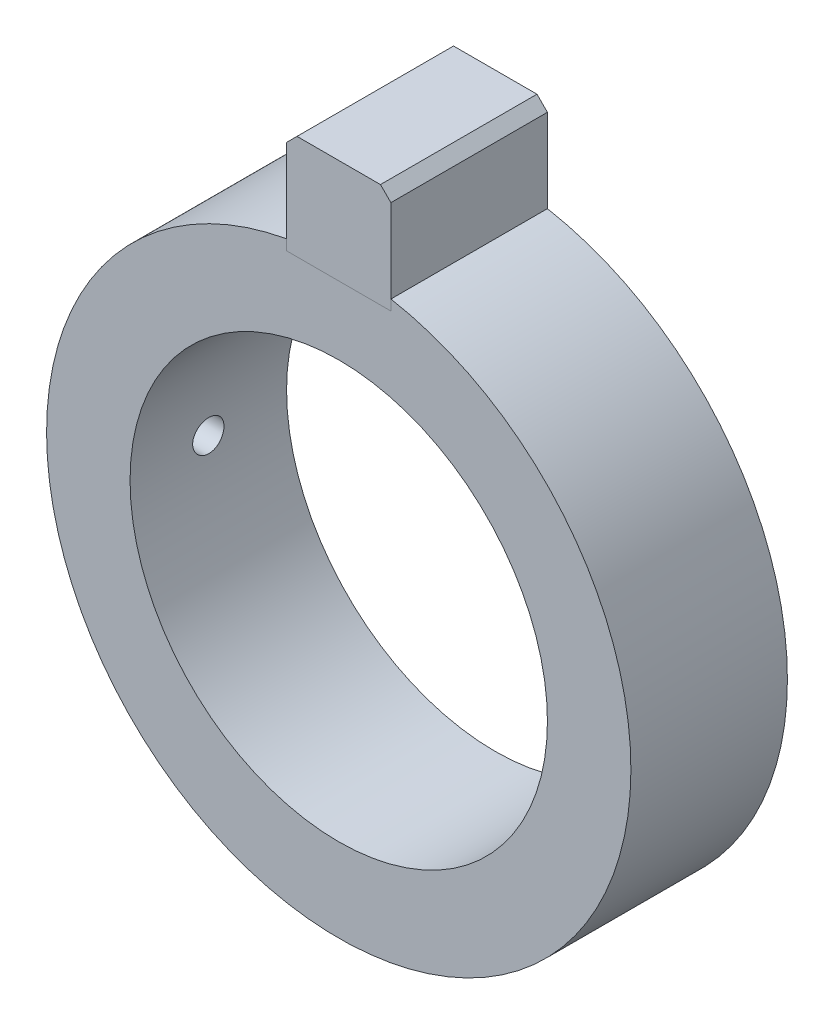
ISO-10303-21;
HEADER;
FILE_DESCRIPTION(('STEP AP214'),'2;1');
FILE_NAME('part.step','',(''),(''),'','','');
FILE_SCHEMA(('AUTOMOTIVE_DESIGN { 1 0 10303 214 1 1 1 1 }'));
ENDSEC;
DATA;
#1=APPLICATION_CONTEXT('core data for automotive mechanical design processes');
#2=APPLICATION_PROTOCOL_DEFINITION('international standard','automotive_design',2000,#1);
#3=PRODUCT_CONTEXT('',#1,'mechanical');
#4=PRODUCT('Part','Part','',(#3));
#5=PRODUCT_RELATED_PRODUCT_CATEGORY('part','',(#4));
#6=PRODUCT_DEFINITION_FORMATION('','',#4);
#7=PRODUCT_DEFINITION_CONTEXT('part definition',#1,'design');
#8=PRODUCT_DEFINITION('design','',#6,#7);
#9=PRODUCT_DEFINITION_SHAPE('','',#8);
#10=(LENGTH_UNIT() NAMED_UNIT(*) SI_UNIT(.MILLI.,.METRE.));
#11=(NAMED_UNIT(*) PLANE_ANGLE_UNIT() SI_UNIT($,.RADIAN.));
#12=(NAMED_UNIT(*) SI_UNIT($,.STERADIAN.) SOLID_ANGLE_UNIT());
#13=UNCERTAINTY_MEASURE_WITH_UNIT(LENGTH_MEASURE(1.E-05),#10,'distance_accuracy_value','');
#14=(GEOMETRIC_REPRESENTATION_CONTEXT(3) GLOBAL_UNCERTAINTY_ASSIGNED_CONTEXT((#13)) GLOBAL_UNIT_ASSIGNED_CONTEXT((#10,
#11,#12)) REPRESENTATION_CONTEXT('',''));
#15=CARTESIAN_POINT('',(0.,0.,0.));
#16=DIRECTION('',(0.,0.,1.));
#17=DIRECTION('',(1.,0.,0.));
#18=AXIS2_PLACEMENT_3D('',#15,#16,#17);
#19=CARTESIAN_POINT('',(-5.,36.5499546279118,15.));
#20=DIRECTION('',(0.,0.,-1.));
#21=DIRECTION('',(-1.,0.,0.));
#22=AXIS2_PLACEMENT_3D('',#19,#20,#21);
#23=PLANE('',#22);
#24=DIRECTION('',(0.,-1.,0.));
#25=VECTOR('',#24,1.);
#26=CARTESIAN_POINT('',(5.,36.5499546279118,15.));
#27=LINE('',#26,#25);
#28=CARTESIAN_POINT('',(5.,35.5499546279118,15.));
#29=VERTEX_POINT('',#28);
#30=CARTESIAN_POINT('',(5.,26.5499546279118,15.));
#31=VERTEX_POINT('',#30);
#32=EDGE_CURVE('E12',#29,#31,#27,.T.);
#33=ORIENTED_EDGE('',*,*,#32,.F.);
#34=DIRECTION('',(0.707106781186547,-0.707106781186548,0.));
#35=VECTOR('',#34,1.);
#36=CARTESIAN_POINT('',(4.,36.5499546279118,15.));
#37=LINE('',#36,#35);
#38=CARTESIAN_POINT('',(4.,36.5499546279118,15.));
#39=VERTEX_POINT('',#38);
#40=EDGE_CURVE('E100',#39,#29,#37,.T.);
#41=ORIENTED_EDGE('',*,*,#40,.F.);
#42=DIRECTION('',(1.,0.,0.));
#43=VECTOR('',#42,1.);
#44=CARTESIAN_POINT('',(-5.,36.5499546279118,15.));
#45=LINE('',#44,#43);
#46=CARTESIAN_POINT('',(-4.,36.5499546279118,15.));
#47=VERTEX_POINT('',#46);
#48=EDGE_CURVE('E127',#47,#39,#45,.T.);
#49=ORIENTED_EDGE('',*,*,#48,.F.);
#50=DIRECTION('',(0.707106781186547,0.707106781186548,0.));
#51=VECTOR('',#50,1.);
#52=CARTESIAN_POINT('',(-4.,36.5499546279118,15.));
#53=LINE('',#52,#51);
#54=CARTESIAN_POINT('',(-5.,35.5499546279118,15.));
#55=VERTEX_POINT('',#54);
#56=EDGE_CURVE('E70',#55,#47,#53,.T.);
#57=ORIENTED_EDGE('',*,*,#56,.F.);
#58=DIRECTION('',(0.,-1.,0.));
#59=VECTOR('',#58,1.);
#60=CARTESIAN_POINT('',(-5.,36.5499546279118,15.));
#61=LINE('',#60,#59);
#62=CARTESIAN_POINT('',(-5.,26.5499546279118,15.));
#63=VERTEX_POINT('',#62);
#64=EDGE_CURVE('E120',#55,#63,#61,.T.);
#65=ORIENTED_EDGE('',*,*,#64,.T.);
#66=DIRECTION('',(1.,0.,0.));
#67=VECTOR('',#66,1.);
#68=CARTESIAN_POINT('',(-5.,26.5499546279118,15.));
#69=LINE('',#68,#67);
#70=EDGE_CURVE('E131',#63,#31,#69,.T.);
#71=ORIENTED_EDGE('',*,*,#70,.T.);
#72=EDGE_LOOP('',(#33,#41,#49,#57,#65,#71));
#73=FACE_BOUND('',#72,.T.);
#74=ADVANCED_FACE('F48',(#73),#23,.F.);
#75=CARTESIAN_POINT('',(5.,36.5499546279118,15.));
#76=DIRECTION('',(-1.,0.,0.));
#77=DIRECTION('',(0.,0.,1.));
#78=AXIS2_PLACEMENT_3D('',#75,#76,#77);
#79=PLANE('',#78);
#80=DIRECTION('',(0.,-1.,0.));
#81=VECTOR('',#80,1.);
#82=CARTESIAN_POINT('',(5.,36.5499546279118,0.));
#83=LINE('',#82,#81);
#84=CARTESIAN_POINT('',(5.,35.5499546279118,0.));
#85=VERTEX_POINT('',#84);
#86=CARTESIAN_POINT('',(5.,26.5499546279118,0.));
#87=VERTEX_POINT('',#86);
#88=EDGE_CURVE('E55',#85,#87,#83,.T.);
#89=ORIENTED_EDGE('',*,*,#88,.F.);
#90=DIRECTION('',(0.,0.,-1.));
#91=VECTOR('',#90,1.);
#92=CARTESIAN_POINT('',(5.,35.5499546279118,16.4142135623731));
#93=LINE('',#92,#91);
#94=EDGE_CURVE('E97',#29,#85,#93,.T.);
#95=ORIENTED_EDGE('',*,*,#94,.F.);
#96=ORIENTED_EDGE('',*,*,#32,.T.);
#97=DIRECTION('',(0.,0.,-1.));
#98=VECTOR('',#97,1.);
#99=CARTESIAN_POINT('',(5.,26.5499546279118,15.));
#100=LINE('',#99,#98);
#101=EDGE_CURVE('E117',#31,#87,#100,.T.);
#102=ORIENTED_EDGE('',*,*,#101,.T.);
#103=EDGE_LOOP('',(#89,#95,#96,#102));
#104=FACE_BOUND('',#103,.T.);
#105=ADVANCED_FACE('F115',(#104),#79,.F.);
#106=CARTESIAN_POINT('',(5.,36.5499546279118,0.));
#107=DIRECTION('',(0.,0.,1.));
#108=DIRECTION('',(1.,0.,0.));
#109=AXIS2_PLACEMENT_3D('',#106,#107,#108);
#110=PLANE('',#109);
#111=DIRECTION('',(-1.,0.,0.));
#112=VECTOR('',#111,1.);
#113=CARTESIAN_POINT('',(5.,36.5499546279118,0.));
#114=LINE('',#113,#112);
#115=CARTESIAN_POINT('',(4.,36.5499546279118,0.));
#116=VERTEX_POINT('',#115);
#117=CARTESIAN_POINT('',(-4.,36.5499546279118,0.));
#118=VERTEX_POINT('',#117);
#119=EDGE_CURVE('E113',#116,#118,#114,.T.);
#120=ORIENTED_EDGE('',*,*,#119,.F.);
#121=DIRECTION('',(-0.707106781186547,0.707106781186548,0.));
#122=VECTOR('',#121,1.);
#123=CARTESIAN_POINT('',(4.,36.5499546279118,0.));
#124=LINE('',#123,#122);
#125=EDGE_CURVE('E62',#85,#116,#124,.T.);
#126=ORIENTED_EDGE('',*,*,#125,.F.);
#127=ORIENTED_EDGE('',*,*,#88,.T.);
#128=DIRECTION('',(-1.,0.,0.));
#129=VECTOR('',#128,1.);
#130=CARTESIAN_POINT('',(5.,26.5499546279118,0.));
#131=LINE('',#130,#129);
#132=CARTESIAN_POINT('',(-5.,26.5499546279118,0.));
#133=VERTEX_POINT('',#132);
#134=EDGE_CURVE('E128',#87,#133,#131,.T.);
#135=ORIENTED_EDGE('',*,*,#134,.T.);
#136=DIRECTION('',(0.,-1.,0.));
#137=VECTOR('',#136,1.);
#138=CARTESIAN_POINT('',(-5.,36.5499546279118,0.));
#139=LINE('',#138,#137);
#140=CARTESIAN_POINT('',(-5.,35.5499546279118,0.));
#141=VERTEX_POINT('',#140);
#142=EDGE_CURVE('E119',#141,#133,#139,.T.);
#143=ORIENTED_EDGE('',*,*,#142,.F.);
#144=DIRECTION('',(-0.707106781186547,-0.707106781186548,0.));
#145=VECTOR('',#144,1.);
#146=CARTESIAN_POINT('',(-4.,36.5499546279118,0.));
#147=LINE('',#146,#145);
#148=EDGE_CURVE('E140',#118,#141,#147,.T.);
#149=ORIENTED_EDGE('',*,*,#148,.F.);
#150=EDGE_LOOP('',(#120,#126,#127,#135,#143,#149));
#151=FACE_BOUND('',#150,.T.);
#152=ADVANCED_FACE('F108',(#151),#110,.F.);
#153=CARTESIAN_POINT('',(-5.,36.5499546279118,0.));
#154=DIRECTION('',(1.,0.,0.));
#155=DIRECTION('',(0.,0.,-1.));
#156=AXIS2_PLACEMENT_3D('',#153,#154,#155);
#157=PLANE('',#156);
#158=ORIENTED_EDGE('',*,*,#64,.F.);
#159=DIRECTION('',(0.,0.,-1.));
#160=VECTOR('',#159,1.);
#161=CARTESIAN_POINT('',(-5.,35.5499546279118,16.4142135623731));
#162=LINE('',#161,#160);
#163=EDGE_CURVE('E139',#55,#141,#162,.T.);
#164=ORIENTED_EDGE('',*,*,#163,.T.);
#165=ORIENTED_EDGE('',*,*,#142,.T.);
#166=DIRECTION('',(0.,0.,1.));
#167=VECTOR('',#166,1.);
#168=CARTESIAN_POINT('',(-5.,26.5499546279118,0.));
#169=LINE('',#168,#167);
#170=EDGE_CURVE('E124',#133,#63,#169,.T.);
#171=ORIENTED_EDGE('',*,*,#170,.T.);
#172=EDGE_LOOP('',(#158,#164,#165,#171));
#173=FACE_BOUND('',#172,.T.);
#174=ADVANCED_FACE('F157',(#173),#157,.F.);
#175=CARTESIAN_POINT('',(0.,36.5499546279118,0.));
#176=DIRECTION('',(0.,1.,0.));
#177=DIRECTION('',(0.,0.,1.));
#178=AXIS2_PLACEMENT_3D('',#175,#176,#177);
#179=PLANE('',#178);
#180=DIRECTION('',(0.,0.,-1.));
#181=VECTOR('',#180,1.);
#182=CARTESIAN_POINT('',(4.,36.5499546279118,16.4142135623731));
#183=LINE('',#182,#181);
#184=EDGE_CURVE('E104',#39,#116,#183,.T.);
#185=ORIENTED_EDGE('',*,*,#184,.T.);
#186=ORIENTED_EDGE('',*,*,#119,.T.);
#187=DIRECTION('',(0.,0.,-1.));
#188=VECTOR('',#187,1.);
#189=CARTESIAN_POINT('',(-4.,36.5499546279118,16.4142135623731));
#190=LINE('',#189,#188);
#191=EDGE_CURVE('E137',#47,#118,#190,.T.);
#192=ORIENTED_EDGE('',*,*,#191,.F.);
#193=ORIENTED_EDGE('',*,*,#48,.T.);
#194=EDGE_LOOP('',(#185,#186,#192,#193));
#195=FACE_BOUND('',#194,.T.);
#196=ADVANCED_FACE('F147',(#195),#179,.T.);
#197=CARTESIAN_POINT('',(0.,26.5499546279118,0.));
#198=DIRECTION('',(0.,1.,0.));
#199=DIRECTION('',(0.,0.,1.));
#200=AXIS2_PLACEMENT_3D('',#197,#198,#199);
#201=PLANE('',#200);
#202=ORIENTED_EDGE('',*,*,#70,.F.);
#203=ORIENTED_EDGE('',*,*,#170,.F.);
#204=ORIENTED_EDGE('',*,*,#134,.F.);
#205=ORIENTED_EDGE('',*,*,#101,.F.);
#206=EDGE_LOOP('',(#202,#203,#204,#205));
#207=FACE_BOUND('',#206,.T.);
#208=ADVANCED_FACE('F152',(#207),#201,.F.);
#209=CARTESIAN_POINT('',(-4.,36.5499546279118,16.4142135623731));
#210=DIRECTION('',(0.707106781186548,-0.707106781186547,0.));
#211=DIRECTION('',(0.707106781186547,0.707106781186548,0.));
#212=AXIS2_PLACEMENT_3D('',#209,#210,#211);
#213=PLANE('',#212);
#214=ORIENTED_EDGE('',*,*,#56,.T.);
#215=ORIENTED_EDGE('',*,*,#191,.T.);
#216=ORIENTED_EDGE('',*,*,#148,.T.);
#217=ORIENTED_EDGE('',*,*,#163,.F.);
#218=EDGE_LOOP('',(#214,#215,#216,#217));
#219=FACE_BOUND('',#218,.T.);
#220=ADVANCED_FACE('F158',(#219),#213,.F.);
#221=CARTESIAN_POINT('',(4.,36.5499546279118,16.4142135623731));
#222=DIRECTION('',(-0.707106781186548,-0.707106781186547,0.));
#223=DIRECTION('',(0.707106781186547,-0.707106781186548,0.));
#224=AXIS2_PLACEMENT_3D('',#221,#222,#223);
#225=PLANE('',#224);
#226=ORIENTED_EDGE('',*,*,#40,.T.);
#227=ORIENTED_EDGE('',*,*,#94,.T.);
#228=ORIENTED_EDGE('',*,*,#125,.T.);
#229=ORIENTED_EDGE('',*,*,#184,.F.);
#230=EDGE_LOOP('',(#226,#227,#228,#229));
#231=FACE_BOUND('',#230,.T.);
#232=ADVANCED_FACE('F98',(#231),#225,.F.);
#233=CLOSED_SHELL('',(#74,#105,#152,#174,#196,#208,#220,#232));
#234=MANIFOLD_SOLID_BREP('B2',#233);
#235=CARTESIAN_POINT('',(0.,0.,15.));
#236=DIRECTION('',(0.,0.,1.));
#237=DIRECTION('',(1.,0.,0.));
#238=AXIS2_PLACEMENT_3D('',#235,#236,#237);
#239=PLANE('',#238);
#240=CARTESIAN_POINT('',(0.,0.,15.));
#241=DIRECTION('',(0.,0.,1.));
#242=DIRECTION('',(1.,0.,0.));
#243=AXIS2_PLACEMENT_3D('',#240,#241,#242);
#244=CIRCLE('',#243,20.);
#245=CARTESIAN_POINT('',(20.,0.,15.));
#246=VERTEX_POINT('',#245);
#247=EDGE_CURVE('E344',#246,#246,#244,.T.);
#248=ORIENTED_EDGE('',*,*,#247,.F.);
#249=EDGE_LOOP('',(#248));
#250=FACE_BOUND('',#249,.T.);
#251=DIRECTION('',(1.,0.,0.));
#252=VECTOR('',#251,1.);
#253=CARTESIAN_POINT('',(0.,26.5499546279118,15.));
#254=LINE('',#253,#252);
#255=CARTESIAN_POINT('',(-5.,26.5499546279118,15.));
#256=VERTEX_POINT('',#255);
#257=CARTESIAN_POINT('',(5.,26.5499546279118,15.));
#258=VERTEX_POINT('',#257);
#259=EDGE_CURVE('E290',#256,#258,#254,.T.);
#260=ORIENTED_EDGE('',*,*,#259,.F.);
#261=DIRECTION('',(0.,-1.,0.));
#262=VECTOR('',#261,1.);
#263=CARTESIAN_POINT('',(-5.,0.,15.));
#264=LINE('',#263,#262);
#265=CARTESIAN_POINT('',(-5.00000000000001,27.5499546279118,15.));
#266=VERTEX_POINT('',#265);
#267=EDGE_CURVE('E274',#266,#256,#264,.T.);
#268=ORIENTED_EDGE('',*,*,#267,.F.);
#269=CARTESIAN_POINT('',(0.,0.,15.));
#270=DIRECTION('',(0.,0.,1.));
#271=DIRECTION('',(1.,0.,0.));
#272=AXIS2_PLACEMENT_3D('',#269,#270,#271);
#273=CIRCLE('',#272,28.);
#274=CARTESIAN_POINT('',(5.,27.5499546279118,15.));
#275=VERTEX_POINT('',#274);
#276=EDGE_CURVE('E46',#266,#275,#273,.T.);
#277=ORIENTED_EDGE('',*,*,#276,.T.);
#278=DIRECTION('',(0.,1.,0.));
#279=VECTOR('',#278,1.);
#280=CARTESIAN_POINT('',(5.,0.,15.));
#281=LINE('',#280,#279);
#282=EDGE_CURVE('E239',#258,#275,#281,.T.);
#283=ORIENTED_EDGE('',*,*,#282,.F.);
#284=EDGE_LOOP('',(#260,#268,#277,#283));
#285=FACE_BOUND('',#284,.T.);
#286=ADVANCED_FACE('F223',(#250,#285),#239,.T.);
#287=CARTESIAN_POINT('',(0.,0.,0.));
#288=DIRECTION('',(0.,0.,1.));
#289=DIRECTION('',(1.,0.,0.));
#290=AXIS2_PLACEMENT_3D('',#287,#288,#289);
#291=PLANE('',#290);
#292=CARTESIAN_POINT('',(0.,0.,0.));
#293=DIRECTION('',(0.,0.,1.));
#294=DIRECTION('',(1.,0.,0.));
#295=AXIS2_PLACEMENT_3D('',#292,#293,#294);
#296=CIRCLE('',#295,20.);
#297=CARTESIAN_POINT('',(20.,0.,0.));
#298=VERTEX_POINT('',#297);
#299=EDGE_CURVE('E347',#298,#298,#296,.T.);
#300=ORIENTED_EDGE('',*,*,#299,.T.);
#301=EDGE_LOOP('',(#300));
#302=FACE_BOUND('',#301,.T.);
#303=DIRECTION('',(0.,-1.,0.));
#304=VECTOR('',#303,1.);
#305=CARTESIAN_POINT('',(-5.,0.,0.));
#306=LINE('',#305,#304);
#307=CARTESIAN_POINT('',(-5.00000000000001,27.5499546279118,0.));
#308=VERTEX_POINT('',#307);
#309=CARTESIAN_POINT('',(-5.,26.5499546279118,0.));
#310=VERTEX_POINT('',#309);
#311=EDGE_CURVE('E273',#308,#310,#306,.T.);
#312=ORIENTED_EDGE('',*,*,#311,.T.);
#313=DIRECTION('',(1.,0.,0.));
#314=VECTOR('',#313,1.);
#315=CARTESIAN_POINT('',(0.,26.5499546279118,0.));
#316=LINE('',#315,#314);
#317=CARTESIAN_POINT('',(5.,26.5499546279118,0.));
#318=VERTEX_POINT('',#317);
#319=EDGE_CURVE('E276',#310,#318,#316,.T.);
#320=ORIENTED_EDGE('',*,*,#319,.T.);
#321=DIRECTION('',(0.,1.,0.));
#322=VECTOR('',#321,1.);
#323=CARTESIAN_POINT('',(5.,0.,0.));
#324=LINE('',#323,#322);
#325=CARTESIAN_POINT('',(5.00000000000001,27.5499546279118,0.));
#326=VERTEX_POINT('',#325);
#327=EDGE_CURVE('E288',#318,#326,#324,.T.);
#328=ORIENTED_EDGE('',*,*,#327,.T.);
#329=CARTESIAN_POINT('',(0.,0.,0.));
#330=DIRECTION('',(0.,0.,1.));
#331=DIRECTION('',(1.,0.,0.));
#332=AXIS2_PLACEMENT_3D('',#329,#330,#331);
#333=CIRCLE('',#332,28.);
#334=EDGE_CURVE('E228',#308,#326,#333,.T.);
#335=ORIENTED_EDGE('',*,*,#334,.F.);
#336=EDGE_LOOP('',(#312,#320,#328,#335));
#337=FACE_BOUND('',#336,.T.);
#338=ADVANCED_FACE('F283',(#302,#337),#291,.F.);
#339=CARTESIAN_POINT('',(0.,0.,15.));
#340=DIRECTION('',(0.,0.,-1.));
#341=DIRECTION('',(-1.,0.,0.));
#342=AXIS2_PLACEMENT_3D('',#339,#340,#341);
#343=CYLINDRICAL_SURFACE('',#342,28.);
#344=CARTESIAN_POINT('',(-28.,0.,9.));
#345=CARTESIAN_POINT('',(-27.9999994633478,-0.0841908703315505,8.99999628726992));
#346=CARTESIAN_POINT('',(-27.9996162149649,-0.168441247563876,8.99288808803925));
#347=CARTESIAN_POINT('',(-27.9981242053863,-0.334617260664676,8.96463319926796));
#348=CARTESIAN_POINT('',(-27.9970145921235,-0.416540048230791,8.94347002201901));
#349=CARTESIAN_POINT('',(-27.9941954259342,-0.57562965220333,8.88771335081122));
#350=CARTESIAN_POINT('',(-27.9924861816237,-0.652798891177386,8.85312676459593));
#351=CARTESIAN_POINT('',(-27.9886601871014,-0.800215644140053,8.77151583201892));
#352=CARTESIAN_POINT('',(-27.9865435323615,-0.870464773958695,8.72449439865948));
#353=CARTESIAN_POINT('',(-27.9821380835772,-1.00214789117652,8.61928925446434));
#354=CARTESIAN_POINT('',(-27.9798491197314,-1.06357300498674,8.56109444295958));
#355=CARTESIAN_POINT('',(-27.9753584925727,-1.1757887507803,8.4352168871769));
#356=CARTESIAN_POINT('',(-27.9731568328503,-1.22657894576212,8.36753375320319));
#357=CARTESIAN_POINT('',(-27.9690878514182,-1.31610854883793,8.22455302429761));
#358=CARTESIAN_POINT('',(-27.9672207263823,-1.35484087788222,8.14925099062866));
#359=CARTESIAN_POINT('',(-27.9640334795802,-1.41910990687632,7.99320121569749));
#360=CARTESIAN_POINT('',(-27.9627133532085,-1.44464671792563,7.91245352029142));
#361=CARTESIAN_POINT('',(-27.9607705355445,-1.4817759681405,7.74788750461906));
#362=CARTESIAN_POINT('',(-27.9601471695513,-1.49338189794029,7.66407223619153));
#363=CARTESIAN_POINT('',(-27.9596661447874,-1.50236156594204,7.4956810066804));
#364=CARTESIAN_POINT('',(-27.9598084792829,-1.49973542930481,7.41110505229301));
#365=CARTESIAN_POINT('',(-27.9608421776918,-1.48033673509933,7.24368500826687));
#366=CARTESIAN_POINT('',(-27.9617327695313,-1.46357875911026,7.1608392236558));
#367=CARTESIAN_POINT('',(-27.9641613919948,-1.4164146859968,6.99913830275129));
#368=CARTESIAN_POINT('',(-27.9656994256561,-1.38600852484424,6.92028318518133));
#369=CARTESIAN_POINT('',(-27.9692504778777,-1.31239457374362,6.76875506118402));
#370=CARTESIAN_POINT('',(-27.9712637426633,-1.26918014463753,6.696085286133));
#371=CARTESIAN_POINT('',(-27.9755381014503,-1.1711811856182,6.5590260131773));
#372=CARTESIAN_POINT('',(-27.9777991974737,-1.11639656130506,6.49463658283791));
#373=CARTESIAN_POINT('',(-27.9823178117639,-0.996730102302013,6.37588091791363));
#374=CARTESIAN_POINT('',(-27.9845753219427,-0.931835642562152,6.32152740408348));
#375=CARTESIAN_POINT('',(-27.9888295905212,-0.793835968382741,6.22448451705817));
#376=CARTESIAN_POINT('',(-27.9908263488505,-0.720730751722383,6.18179514701788));
#377=CARTESIAN_POINT('',(-27.9943341902617,-0.568377238078071,6.10929352356661));
#378=CARTESIAN_POINT('',(-27.995845256225,-0.489128724689352,6.07948172402637));
#379=CARTESIAN_POINT('',(-27.9982111759336,-0.326741530396964,6.03358985170195));
#380=CARTESIAN_POINT('',(-27.9990660353148,-0.243602882910492,6.01750966098275));
#381=CARTESIAN_POINT('',(-28.0000224768456,-0.0759058371935306,5.99955316424703));
#382=CARTESIAN_POINT('',(-28.0001249920132,0.0086506721304102,5.99765926507161));
#383=CARTESIAN_POINT('',(-27.9995676703029,0.176880258384261,6.00808318524722));
#384=CARTESIAN_POINT('',(-27.9989078363261,0.260553338674797,6.02040095051642));
#385=CARTESIAN_POINT('',(-27.9969007256478,0.424591528071888,6.05888398055824));
#386=CARTESIAN_POINT('',(-27.9955538482588,0.504958529397875,6.08504120210934));
#387=CARTESIAN_POINT('',(-27.9923242610898,0.660161556435215,6.15045247928875));
#388=CARTESIAN_POINT('',(-27.9904415477662,0.734997545565592,6.18970662152794));
#389=CARTESIAN_POINT('',(-27.9863496945997,0.877094954453578,6.28024243466981));
#390=CARTESIAN_POINT('',(-27.9841402357839,0.944348858136598,6.33153588754468));
#391=CARTESIAN_POINT('',(-27.9796447391046,1.06929740900973,6.44467709234547));
#392=CARTESIAN_POINT('',(-27.9773587006811,1.1269919862735,6.50652492146979));
#393=CARTESIAN_POINT('',(-27.9729650296767,1.23124347439574,6.63909498825914));
#394=CARTESIAN_POINT('',(-27.9708575809684,1.27778899430772,6.7098261905458));
#395=CARTESIAN_POINT('',(-27.967061640593,1.35834324256427,6.8581099736825));
#396=CARTESIAN_POINT('',(-27.9653731469015,1.39235203148904,6.93566252156809));
#397=CARTESIAN_POINT('',(-27.9626068399447,1.44684760668971,7.09534551940399));
#398=CARTESIAN_POINT('',(-27.9615286998696,1.4673416303323,7.17747349354504));
#399=CARTESIAN_POINT('',(-27.9601037644532,1.4942495866905,7.34401060990072));
#400=CARTESIAN_POINT('',(-27.9597569641448,1.50066361503558,7.42841973661813));
#401=CARTESIAN_POINT('',(-27.9598339378658,1.4992286084332,7.59700974632593));
#402=CARTESIAN_POINT('',(-27.960256743961,1.4913974896175,7.68119078284543));
#403=CARTESIAN_POINT('',(-27.9618232324073,1.46173155028394,7.8470410542213));
#404=CARTESIAN_POINT('',(-27.9629669161162,1.43989670338969,7.92871028434631));
#405=CARTESIAN_POINT('',(-27.9658460391189,1.38284689429682,8.08722208629698));
#406=CARTESIAN_POINT('',(-27.9675814808333,1.34763187736733,8.16406463837787));
#407=CARTESIAN_POINT('',(-27.9714484814745,1.26482422527973,8.31074826899349));
#408=CARTESIAN_POINT('',(-27.9735800287463,1.21723195429362,8.38058955344054));
#409=CARTESIAN_POINT('',(-27.9780020895241,1.11095584910966,8.51137808956508));
#410=CARTESIAN_POINT('',(-27.9802927824967,1.05225936002346,8.5723150516311));
#411=CARTESIAN_POINT('',(-27.9847736065645,0.925452465262195,8.68348989029199));
#412=CARTESIAN_POINT('',(-27.9869637128184,0.857339750582701,8.73372513495901));
#413=CARTESIAN_POINT('',(-27.9909982865974,0.713574120508163,8.82209755519432));
#414=CARTESIAN_POINT('',(-27.9928423954537,0.637913503835539,8.86022220469751));
#415=CARTESIAN_POINT('',(-27.9959719822449,0.481311514193597,8.92318135696428));
#416=CARTESIAN_POINT('',(-27.9972581182056,0.400376491745975,8.94803152257413));
#417=CARTESIAN_POINT('',(-27.998787484093,0.265783850006309,8.97723367690935));
#418=CARTESIAN_POINT('',(-27.9992401733854,0.212997554966114,8.98576011176569));
#419=CARTESIAN_POINT('',(-27.9998466014459,0.106815492032727,8.99714444838527));
#420=CARTESIAN_POINT('',(-28.0000003405097,0.0534197247423331,9.00000235575447));
#421=CARTESIAN_POINT('',(-28.,0.,9.));
#422=B_SPLINE_CURVE_WITH_KNOTS('',3,(#344,#345,#346,#347,#348,#349,#350,#351,#352,#353,#354,
#355,#356,#357,#358,#359,#360,#361,#362,#363,#364,#365,#366,#367,#368,#369,#370,#371,#372,#373,
#374,#375,#376,#377,#378,#379,#380,#381,#382,#383,#384,#385,#386,#387,#388,#389,#390,#391,#392,
#393,#394,#395,#396,#397,#398,#399,#400,#401,#402,#403,#404,#405,#406,#407,#408,#409,#410,#411,
#412,#413,#414,#415,#416,#417,#418,#419,#420,#421),.UNSPECIFIED.,.T.,.F.,(4,2,2,2,2,2,2,2,2,2,2,
2,2,2,2,2,2,2,2,2,2,2,2,2,2,2,2,2,2,2,2,2,2,2,2,2,2,2,4),(0.,0.252377605995383,
0.505051797002765,0.75759613283154,1.01008135964684,1.26281873893681,1.51556650147044,
1.76846237100883,2.02135611125905,2.27400475168351,2.52665117024833,2.77903722054676,
3.0314244548846,3.28394274347602,3.53646309241489,3.78930135179949,4.04213967957076,
4.29498691791672,4.54783198464202,4.8003634330364,5.05289392043696,5.30527780300942,
5.55766335464756,5.81029693459516,6.06293236247244,6.31582481635638,6.56871604819328,
6.82147174263416,7.07422572038633,7.32666202904345,7.57909881317263,7.83153662989229,
8.08396702005483,8.33668684394065,8.58946874893024,8.84251126290193,9.09525454341021,
9.25539014390326,9.41552558602791),.UNSPECIFIED.);
#423=CARTESIAN_POINT('',(-28.,0.,9.));
#424=VERTEX_POINT('',#423);
#425=EDGE_CURVE('E304',#424,#424,#422,.T.);
#426=ORIENTED_EDGE('',*,*,#425,.T.);
#427=EDGE_LOOP('',(#426));
#428=FACE_BOUND('',#427,.T.);
#429=DIRECTION('',(0.,0.,-1.));
#430=VECTOR('',#429,1.);
#431=CARTESIAN_POINT('',(-5.00000000000001,27.5499546279118,25.1045846812778));
#432=LINE('',#431,#430);
#433=EDGE_CURVE('E264',#266,#308,#432,.T.);
#434=ORIENTED_EDGE('',*,*,#433,.T.);
#435=ORIENTED_EDGE('',*,*,#334,.T.);
#436=DIRECTION('',(0.,0.,-1.));
#437=VECTOR('',#436,1.);
#438=CARTESIAN_POINT('',(5.00000000000001,27.5499546279118,25.1045846812778));
#439=LINE('',#438,#437);
#440=EDGE_CURVE('E255',#275,#326,#439,.T.);
#441=ORIENTED_EDGE('',*,*,#440,.F.);
#442=ORIENTED_EDGE('',*,*,#276,.F.);
#443=EDGE_LOOP('',(#434,#435,#441,#442));
#444=FACE_BOUND('',#443,.T.);
#445=ADVANCED_FACE('F225',(#428,#444),#343,.T.);
#446=CARTESIAN_POINT('',(0.,0.,15.));
#447=DIRECTION('',(0.,0.,-1.));
#448=DIRECTION('',(-1.,0.,0.));
#449=AXIS2_PLACEMENT_3D('',#446,#447,#448);
#450=CYLINDRICAL_SURFACE('',#449,20.);
#451=CARTESIAN_POINT('',(-20.,0.,9.));
#452=CARTESIAN_POINT('',(-19.9999992582729,0.0841288095114433,8.99999631318298));
#453=CARTESIAN_POINT('',(-19.9994635090758,0.168315601024087,8.99289854655941));
#454=CARTESIAN_POINT('',(-19.9973778078798,0.334361941971538,8.96468751545672));
#455=CARTESIAN_POINT('',(-19.9958266932389,0.416218711162994,8.94355818376301));
#456=CARTESIAN_POINT('',(-19.9918856268593,0.575175965959819,8.88789667188027));
#457=CARTESIAN_POINT('',(-19.9894961359011,0.652279036935093,8.8533718528915));
#458=CARTESIAN_POINT('',(-19.9841466247064,0.79957648067802,8.77191204713627));
#459=CARTESIAN_POINT('',(-19.9811867302827,0.86977237179985,8.72497979620403));
#460=CARTESIAN_POINT('',(-19.975021868989,1.00142895753255,8.61993077946249));
#461=CARTESIAN_POINT('',(-19.971816458291,1.06287322971852,8.56179345591577));
#462=CARTESIAN_POINT('',(-19.9655255838438,1.17514165369782,8.43602770265508));
#463=CARTESIAN_POINT('',(-19.9624401252546,1.22596534904266,8.36839886522593));
#464=CARTESIAN_POINT('',(-19.9567335395977,1.31560383874766,8.2254725451906));
#465=CARTESIAN_POINT('',(-19.954112961772,1.35440446810332,8.15016615496991));
#466=CARTESIAN_POINT('',(-19.9496376121017,1.41880489046782,7.9940846276562));
#467=CARTESIAN_POINT('',(-19.947782829037,1.44440487688688,7.91330957070739));
#468=CARTESIAN_POINT('',(-19.9450525889002,1.48163037657928,7.74874610759945));
#469=CARTESIAN_POINT('',(-19.9441752805014,1.49328231044217,7.66496370919238));
#470=CARTESIAN_POINT('',(-19.9434933892539,1.50236254574838,7.4966280467393));
#471=CARTESIAN_POINT('',(-19.943688789744,1.49979106810858,7.41207479468649));
#472=CARTESIAN_POINT('',(-19.9451285636931,1.48051934417569,7.24477818894611));
#473=CARTESIAN_POINT('',(-19.9463708093904,1.46384775676394,7.16203151303583));
#474=CARTESIAN_POINT('',(-19.9497609519804,1.4168935522692,7.00051430288442));
#475=CARTESIAN_POINT('',(-19.9519088562398,1.38661082447336,6.92174380099124));
#476=CARTESIAN_POINT('',(-19.9568707353614,1.31326167189701,6.77032328376116));
#477=CARTESIAN_POINT('',(-19.9596853828031,1.27018232726496,6.69767954982319));
#478=CARTESIAN_POINT('',(-19.9656629459514,1.17247213743423,6.56064333713513));
#479=CARTESIAN_POINT('',(-19.9688258673499,1.11784110342877,6.49625099327765));
#480=CARTESIAN_POINT('',(-19.9751530336147,0.998417278432274,6.37737874175642));
#481=CARTESIAN_POINT('',(-19.978317262423,0.933599700176314,6.32292373240528));
#482=CARTESIAN_POINT('',(-19.9842830152099,0.795729375934442,6.2256642364343));
#483=CARTESIAN_POINT('',(-19.9870845390023,0.722676625718591,6.18285975579872));
#484=CARTESIAN_POINT('',(-19.9920096041928,0.570393940216334,6.11011816975623));
#485=CARTESIAN_POINT('',(-19.994133091137,0.491163509428977,6.0801820977587));
#486=CARTESIAN_POINT('',(-19.9974621500133,0.328781652774542,6.03404418779515));
#487=CARTESIAN_POINT('',(-19.998667737375,0.245630292842572,6.01784211896234));
#488=CARTESIAN_POINT('',(-20.0000231735387,0.07798284378375,5.99966319046105));
#489=CARTESIAN_POINT('',(-20.0001755757578,-0.00650949482532147,5.99765192534582));
#490=CARTESIAN_POINT('',(-19.9994142771364,-0.174630230993064,6.00782166806971));
#491=CARTESIAN_POINT('',(-19.9985005843262,-0.258258635054598,6.0200025690053));
#492=CARTESIAN_POINT('',(-19.9957115375324,-0.422180011176505,6.05818236881058));
#493=CARTESIAN_POINT('',(-19.9938372886011,-0.502476701646071,6.08416539055867));
#494=CARTESIAN_POINT('',(-19.989337809084,-0.657570327384029,6.14919569363672));
#495=CARTESIAN_POINT('',(-19.9867125688255,-0.732367191799398,6.18824314323682));
#496=CARTESIAN_POINT('',(-19.9809993255836,-0.87449495937676,6.27838083789787));
#497=CARTESIAN_POINT('',(-19.9779104477497,-0.941811320255548,6.32949395671883));
#498=CARTESIAN_POINT('',(-19.9716201639251,-1.06692059601702,6.44227892546908));
#499=CARTESIAN_POINT('',(-19.9684187563498,-1.1247133767348,6.50395092412326));
#500=CARTESIAN_POINT('',(-19.9622567375937,-1.22925234979154,6.63625194013212));
#501=CARTESIAN_POINT('',(-19.9592966224009,-1.27597614708765,6.70689867943298));
#502=CARTESIAN_POINT('',(-19.9539590285433,-1.35689744472608,6.85505519838154));
#503=CARTESIAN_POINT('',(-19.951581545017,-1.39109504958689,6.93256492075783));
#504=CARTESIAN_POINT('',(-19.9476809567371,-1.44595479238458,7.09216680748731));
#505=CARTESIAN_POINT('',(-19.9461569763152,-1.46663080672911,7.17425417985272));
#506=CARTESIAN_POINT('',(-19.9441328652441,-1.49390569339177,7.34074723101572));
#507=CARTESIAN_POINT('',(-19.9436327190765,-1.50050477907388,7.42515287465563));
#508=CARTESIAN_POINT('',(-19.9437130691626,-1.49943621553155,7.59366391324741));
#509=CARTESIAN_POINT('',(-19.9442908995857,-1.49180376085723,7.67776953489614));
#510=CARTESIAN_POINT('',(-19.9464564369575,-1.46256198193398,7.84350108371));
#511=CARTESIAN_POINT('',(-19.9480441455862,-1.44095263443385,7.92512700674981));
#512=CARTESIAN_POINT('',(-19.952049853556,-1.38437900273526,8.08358560842179));
#513=CARTESIAN_POINT('',(-19.9544678255495,-1.34941515840954,8.16041844483254));
#514=CARTESIAN_POINT('',(-19.9598616237908,-1.26712924619683,8.30712895771457));
#515=CARTESIAN_POINT('',(-19.9628374388208,-1.21980742681008,8.3770067740018));
#516=CARTESIAN_POINT('',(-19.9690203079162,-1.11401708946727,8.50800334997104));
#517=CARTESIAN_POINT('',(-19.972227887963,-1.05552268820001,8.5691011816401));
#518=CARTESIAN_POINT('',(-19.9785081329158,-0.929090973452718,8.68063405031084));
#519=CARTESIAN_POINT('',(-19.9815807648333,-0.861151367795686,8.73106649150606));
#520=CARTESIAN_POINT('',(-19.9872494022766,-0.717650416603838,8.81989116253911));
#521=CARTESIAN_POINT('',(-19.9898446437752,-0.642077148267444,8.85826416049103));
#522=CARTESIAN_POINT('',(-19.9942566719576,-0.485593917915209,8.92172828444031));
#523=CARTESIAN_POINT('',(-19.9960743603405,-0.404690263737666,8.94683480306825));
#524=CARTESIAN_POINT('',(-19.9982556200579,-0.269417916724369,8.97660198852695));
#525=CARTESIAN_POINT('',(-19.9989068154638,-0.215921192938042,8.98536471878942));
#526=CARTESIAN_POINT('',(-19.9997792437292,-0.108290987947989,8.99706490515231));
#527=CARTESIAN_POINT('',(-20.0000004774832,-0.0541575080690677,9.00000237337036));
#528=CARTESIAN_POINT('',(-20.,0.,9.));
#529=B_SPLINE_CURVE_WITH_KNOTS('',3,(#451,#452,#453,#454,#455,#456,#457,#458,#459,#460,#461,
#462,#463,#464,#465,#466,#467,#468,#469,#470,#471,#472,#473,#474,#475,#476,#477,#478,#479,#480,
#481,#482,#483,#484,#485,#486,#487,#488,#489,#490,#491,#492,#493,#494,#495,#496,#497,#498,#499,
#500,#501,#502,#503,#504,#505,#506,#507,#508,#509,#510,#511,#512,#513,#514,#515,#516,#517,#518,
#519,#520,#521,#522,#523,#524,#525,#526,#527,#528),.UNSPECIFIED.,.T.,.F.,(4,2,2,2,2,2,2,2,2,2,2,
2,2,2,2,2,2,2,2,2,2,2,2,2,2,2,2,2,2,2,2,2,2,2,2,2,2,2,4),(0.,0.252188706341404,
0.504666687116076,0.757006120137035,1.00928995874569,1.2620411413344,1.51480318436672,
1.76786189721255,2.02091690224424,2.27349180470371,2.52606278420137,2.7781216361643,
3.0301825384079,3.28249879898397,3.53481918386621,3.78776333637314,4.04070761880367,
4.29367221036427,4.54663254953898,4.79897937776532,5.05132430518305,5.30337957695229,
5.55543809532427,5.8079783521194,6.06052216631005,6.31357265115638,6.56662102450254,
6.81940930006921,7.07219374409736,7.32435388202406,7.57651443943157,7.82866669184701,
8.08081387425119,8.33355244628147,8.58635246072108,8.83955360771711,9.09246032562224,
9.25480590484756,9.41715114636384),.UNSPECIFIED.);
#530=CARTESIAN_POINT('',(-20.,0.,9.));
#531=VERTEX_POINT('',#530);
#532=EDGE_CURVE('E293',#531,#531,#529,.T.);
#533=ORIENTED_EDGE('',*,*,#532,.T.);
#534=EDGE_LOOP('',(#533));
#535=FACE_BOUND('',#534,.T.);
#536=ORIENTED_EDGE('',*,*,#247,.T.);
#537=EDGE_LOOP('',(#536));
#538=FACE_BOUND('',#537,.T.);
#539=ORIENTED_EDGE('',*,*,#299,.F.);
#540=EDGE_LOOP('',(#539));
#541=FACE_BOUND('',#540,.T.);
#542=ADVANCED_FACE('F331',(#535,#538,#541),#450,.F.);
#543=CARTESIAN_POINT('',(28.001,0.,7.5));
#544=DIRECTION('',(-1.,0.,0.));
#545=DIRECTION('',(0.,0.,1.));
#546=AXIS2_PLACEMENT_3D('',#543,#544,#545);
#547=CYLINDRICAL_SURFACE('',#546,1.5);
#548=ORIENTED_EDGE('',*,*,#532,.F.);
#549=EDGE_LOOP('',(#548));
#550=FACE_BOUND('',#549,.T.);
#551=ORIENTED_EDGE('',*,*,#425,.F.);
#552=EDGE_LOOP('',(#551));
#553=FACE_BOUND('',#552,.T.);
#554=ADVANCED_FACE('F309',(#550,#553),#547,.F.);
#555=CARTESIAN_POINT('',(-5.,0.,25.1045846812778));
#556=DIRECTION('',(1.,0.,0.));
#557=DIRECTION('',(0.,0.,-1.));
#558=AXIS2_PLACEMENT_3D('',#555,#556,#557);
#559=PLANE('',#558);
#560=ORIENTED_EDGE('',*,*,#267,.T.);
#561=DIRECTION('',(0.,0.,-1.));
#562=VECTOR('',#561,1.);
#563=CARTESIAN_POINT('',(-5.,26.5499546279118,25.1045846812778));
#564=LINE('',#563,#562);
#565=EDGE_CURVE('E270',#256,#310,#564,.T.);
#566=ORIENTED_EDGE('',*,*,#565,.T.);
#567=ORIENTED_EDGE('',*,*,#311,.F.);
#568=ORIENTED_EDGE('',*,*,#433,.F.);
#569=EDGE_LOOP('',(#560,#566,#567,#568));
#570=FACE_BOUND('',#569,.T.);
#571=ADVANCED_FACE('F271',(#570),#559,.T.);
#572=CARTESIAN_POINT('',(0.,26.5499546279118,25.1045846812778));
#573=DIRECTION('',(0.,1.,0.));
#574=DIRECTION('',(0.,0.,1.));
#575=AXIS2_PLACEMENT_3D('',#572,#573,#574);
#576=PLANE('',#575);
#577=ORIENTED_EDGE('',*,*,#259,.T.);
#578=DIRECTION('',(0.,0.,-1.));
#579=VECTOR('',#578,1.);
#580=CARTESIAN_POINT('',(5.,26.5499546279118,25.1045846812778));
#581=LINE('',#580,#579);
#582=EDGE_CURVE('E247',#258,#318,#581,.T.);
#583=ORIENTED_EDGE('',*,*,#582,.T.);
#584=ORIENTED_EDGE('',*,*,#319,.F.);
#585=ORIENTED_EDGE('',*,*,#565,.F.);
#586=EDGE_LOOP('',(#577,#583,#584,#585));
#587=FACE_BOUND('',#586,.T.);
#588=ADVANCED_FACE('F279',(#587),#576,.T.);
#589=CARTESIAN_POINT('',(5.,0.,25.1045846812778));
#590=DIRECTION('',(-1.,0.,0.));
#591=DIRECTION('',(0.,0.,1.));
#592=AXIS2_PLACEMENT_3D('',#589,#590,#591);
#593=PLANE('',#592);
#594=ORIENTED_EDGE('',*,*,#282,.T.);
#595=ORIENTED_EDGE('',*,*,#440,.T.);
#596=ORIENTED_EDGE('',*,*,#327,.F.);
#597=ORIENTED_EDGE('',*,*,#582,.F.);
#598=EDGE_LOOP('',(#594,#595,#596,#597));
#599=FACE_BOUND('',#598,.T.);
#600=ADVANCED_FACE('F318',(#599),#593,.T.);
#601=CLOSED_SHELL('',(#286,#338,#445,#542,#554,#571,#588,#600));
#602=MANIFOLD_SOLID_BREP('B6',#601);
#603=ADVANCED_BREP_SHAPE_REPRESENTATION('',(#18,#234,#602),#14);
#604=SHAPE_DEFINITION_REPRESENTATION(#9,#603);
ENDSEC;
END-ISO-10303-21;
